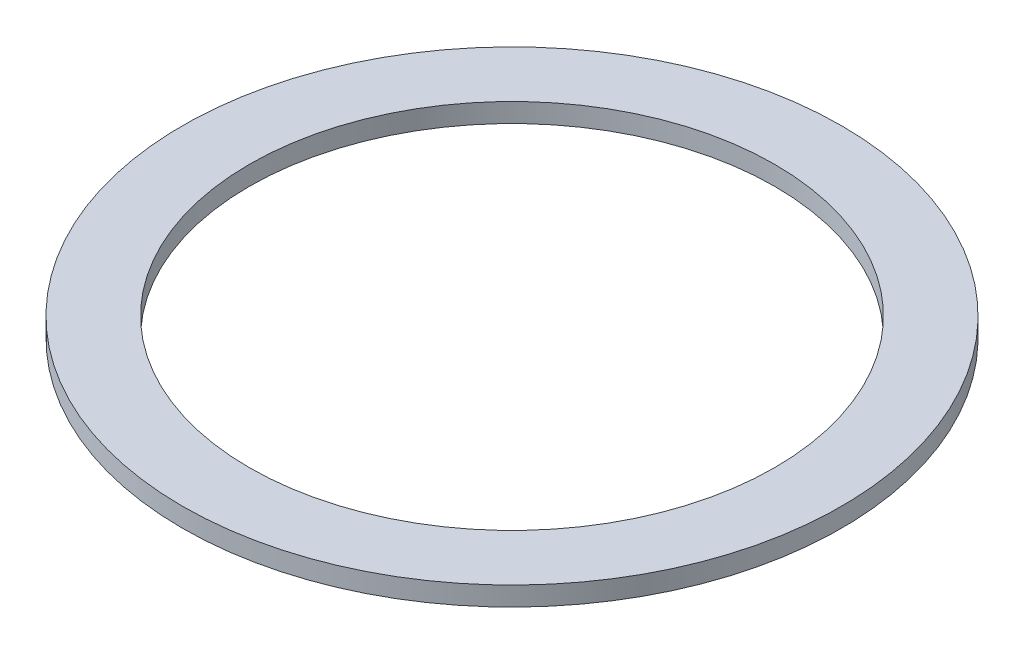
ISO-10303-21;
HEADER;
FILE_DESCRIPTION(('STEP AP214'),'2;1');
FILE_NAME('part.step','',(''),(''),'','','');
FILE_SCHEMA(('AUTOMOTIVE_DESIGN { 1 0 10303 214 1 1 1 1 }'));
ENDSEC;
DATA;
#1=APPLICATION_CONTEXT('core data for automotive mechanical design processes');
#2=APPLICATION_PROTOCOL_DEFINITION('international standard','automotive_design',2000,#1);
#3=PRODUCT_CONTEXT('',#1,'mechanical');
#4=PRODUCT('Part','Part','',(#3));
#5=PRODUCT_RELATED_PRODUCT_CATEGORY('part','',(#4));
#6=PRODUCT_DEFINITION_FORMATION('','',#4);
#7=PRODUCT_DEFINITION_CONTEXT('part definition',#1,'design');
#8=PRODUCT_DEFINITION('design','',#6,#7);
#9=PRODUCT_DEFINITION_SHAPE('','',#8);
#10=(LENGTH_UNIT() NAMED_UNIT(*) SI_UNIT(.MILLI.,.METRE.));
#11=(NAMED_UNIT(*) PLANE_ANGLE_UNIT() SI_UNIT($,.RADIAN.));
#12=(NAMED_UNIT(*) SI_UNIT($,.STERADIAN.) SOLID_ANGLE_UNIT());
#13=UNCERTAINTY_MEASURE_WITH_UNIT(LENGTH_MEASURE(1.E-05),#10,'distance_accuracy_value','');
#14=(GEOMETRIC_REPRESENTATION_CONTEXT(3) GLOBAL_UNCERTAINTY_ASSIGNED_CONTEXT((#13)) GLOBAL_UNIT_ASSIGNED_CONTEXT((#10,
#11,#12)) REPRESENTATION_CONTEXT('',''));
#15=CARTESIAN_POINT('',(0.,0.,0.));
#16=DIRECTION('',(0.,0.,1.));
#17=DIRECTION('',(1.,0.,0.));
#18=AXIS2_PLACEMENT_3D('',#15,#16,#17);
#19=CARTESIAN_POINT('',(0.,2.,0.));
#20=DIRECTION('',(0.,1.,0.));
#21=DIRECTION('',(0.,0.,1.));
#22=AXIS2_PLACEMENT_3D('',#19,#20,#21);
#23=PLANE('',#22);
#24=CARTESIAN_POINT('',(0.,2.,0.));
#25=DIRECTION('',(0.,1.,0.));
#26=DIRECTION('',(0.,0.,1.));
#27=AXIS2_PLACEMENT_3D('',#24,#25,#26);
#28=CIRCLE('',#27,34.5);
#29=CARTESIAN_POINT('',(0.,2.,34.5));
#30=VERTEX_POINT('',#29);
#31=EDGE_CURVE('E10',#30,#30,#28,.T.);
#32=ORIENTED_EDGE('',*,*,#31,.T.);
#33=EDGE_LOOP('',(#32));
#34=FACE_BOUND('',#33,.T.);
#35=CARTESIAN_POINT('',(0.,2.,0.));
#36=DIRECTION('',(0.,1.,0.));
#37=DIRECTION('',(0.,0.,1.));
#38=AXIS2_PLACEMENT_3D('',#35,#36,#37);
#39=CIRCLE('',#38,27.5);
#40=CARTESIAN_POINT('',(0.,2.,27.5));
#41=VERTEX_POINT('',#40);
#42=EDGE_CURVE('E48',#41,#41,#39,.T.);
#43=ORIENTED_EDGE('',*,*,#42,.F.);
#44=EDGE_LOOP('',(#43));
#45=FACE_BOUND('',#44,.T.);
#46=ADVANCED_FACE('F37',(#34,#45),#23,.T.);
#47=CARTESIAN_POINT('',(0.,0.,0.));
#48=DIRECTION('',(0.,1.,0.));
#49=DIRECTION('',(0.,0.,1.));
#50=AXIS2_PLACEMENT_3D('',#47,#48,#49);
#51=PLANE('',#50);
#52=CARTESIAN_POINT('',(0.,0.,0.));
#53=DIRECTION('',(0.,1.,0.));
#54=DIRECTION('',(0.,0.,1.));
#55=AXIS2_PLACEMENT_3D('',#52,#53,#54);
#56=CIRCLE('',#55,34.5);
#57=CARTESIAN_POINT('',(0.,0.,34.5));
#58=VERTEX_POINT('',#57);
#59=EDGE_CURVE('E41',#58,#58,#56,.T.);
#60=ORIENTED_EDGE('',*,*,#59,.F.);
#61=EDGE_LOOP('',(#60));
#62=FACE_BOUND('',#61,.T.);
#63=CARTESIAN_POINT('',(0.,0.,0.));
#64=DIRECTION('',(0.,1.,0.));
#65=DIRECTION('',(0.,0.,1.));
#66=AXIS2_PLACEMENT_3D('',#63,#64,#65);
#67=CIRCLE('',#66,27.5);
#68=CARTESIAN_POINT('',(0.,0.,27.5));
#69=VERTEX_POINT('',#68);
#70=EDGE_CURVE('E50',#69,#69,#67,.T.);
#71=ORIENTED_EDGE('',*,*,#70,.T.);
#72=EDGE_LOOP('',(#71));
#73=FACE_BOUND('',#72,.T.);
#74=ADVANCED_FACE('F60',(#62,#73),#51,.F.);
#75=CARTESIAN_POINT('',(0.,2.,0.));
#76=DIRECTION('',(0.,-1.,0.));
#77=DIRECTION('',(0.,0.,-1.));
#78=AXIS2_PLACEMENT_3D('',#75,#76,#77);
#79=CYLINDRICAL_SURFACE('',#78,34.5);
#80=ORIENTED_EDGE('',*,*,#31,.F.);
#81=EDGE_LOOP('',(#80));
#82=FACE_BOUND('',#81,.T.);
#83=ORIENTED_EDGE('',*,*,#59,.T.);
#84=EDGE_LOOP('',(#83));
#85=FACE_BOUND('',#84,.T.);
#86=ADVANCED_FACE('F39',(#82,#85),#79,.T.);
#87=CARTESIAN_POINT('',(0.,2.,0.));
#88=DIRECTION('',(0.,-1.,0.));
#89=DIRECTION('',(0.,0.,-1.));
#90=AXIS2_PLACEMENT_3D('',#87,#88,#89);
#91=CYLINDRICAL_SURFACE('',#90,27.5);
#92=ORIENTED_EDGE('',*,*,#42,.T.);
#93=EDGE_LOOP('',(#92));
#94=FACE_BOUND('',#93,.T.);
#95=ORIENTED_EDGE('',*,*,#70,.F.);
#96=EDGE_LOOP('',(#95));
#97=FACE_BOUND('',#96,.T.);
#98=ADVANCED_FACE('F56',(#94,#97),#91,.F.);
#99=CLOSED_SHELL('',(#46,#74,#86,#98));
#100=MANIFOLD_SOLID_BREP('B2',#99);
#101=ADVANCED_BREP_SHAPE_REPRESENTATION('',(#18,#100),#14);
#102=SHAPE_DEFINITION_REPRESENTATION(#9,#101);
ENDSEC;
END-ISO-10303-21;
